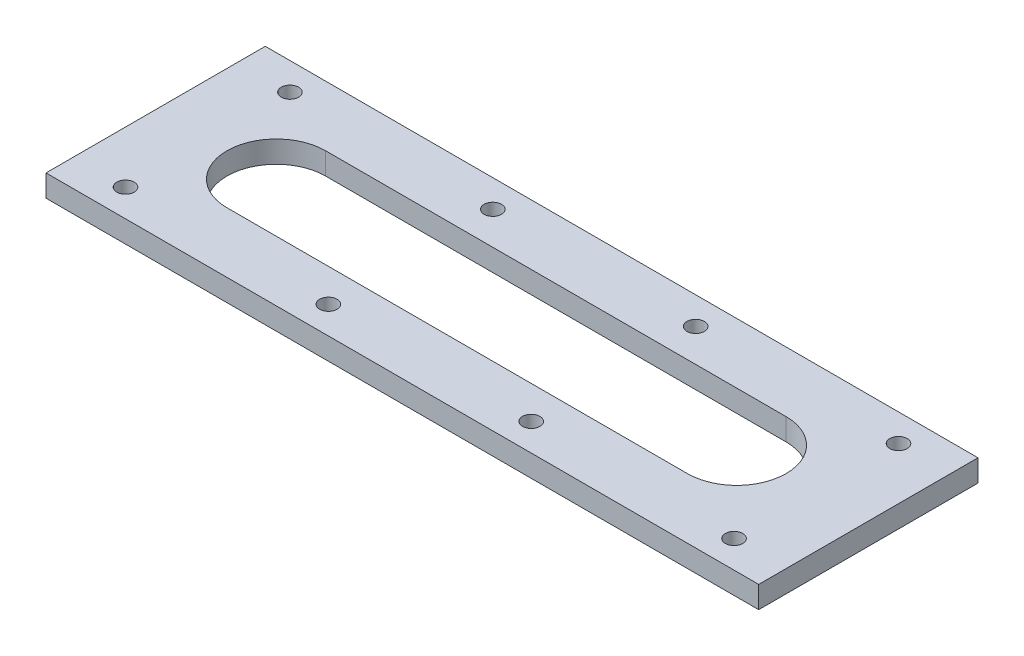
ISO-10303-21;
HEADER;
FILE_DESCRIPTION(('STEP AP214'),'2;1');
FILE_NAME('part.step','',(''),(''),'','','');
FILE_SCHEMA(('AUTOMOTIVE_DESIGN { 1 0 10303 214 1 1 1 1 }'));
ENDSEC;
DATA;
#1=APPLICATION_CONTEXT('core data for automotive mechanical design processes');
#2=APPLICATION_PROTOCOL_DEFINITION('international standard','automotive_design',2000,#1);
#3=PRODUCT_CONTEXT('',#1,'mechanical');
#4=PRODUCT('Part','Part','',(#3));
#5=PRODUCT_RELATED_PRODUCT_CATEGORY('part','',(#4));
#6=PRODUCT_DEFINITION_FORMATION('','',#4);
#7=PRODUCT_DEFINITION_CONTEXT('part definition',#1,'design');
#8=PRODUCT_DEFINITION('design','',#6,#7);
#9=PRODUCT_DEFINITION_SHAPE('','',#8);
#10=(LENGTH_UNIT() NAMED_UNIT(*) SI_UNIT(.MILLI.,.METRE.));
#11=(NAMED_UNIT(*) PLANE_ANGLE_UNIT() SI_UNIT($,.RADIAN.));
#12=(NAMED_UNIT(*) SI_UNIT($,.STERADIAN.) SOLID_ANGLE_UNIT());
#13=UNCERTAINTY_MEASURE_WITH_UNIT(LENGTH_MEASURE(1.E-05),#10,'distance_accuracy_value','');
#14=(GEOMETRIC_REPRESENTATION_CONTEXT(3) GLOBAL_UNCERTAINTY_ASSIGNED_CONTEXT((#13)) GLOBAL_UNIT_ASSIGNED_CONTEXT((#10,
#11,#12)) REPRESENTATION_CONTEXT('',''));
#15=CARTESIAN_POINT('',(0.,0.,0.));
#16=DIRECTION('',(0.,0.,1.));
#17=DIRECTION('',(1.,0.,0.));
#18=AXIS2_PLACEMENT_3D('',#15,#16,#17);
#19=CARTESIAN_POINT('',(0.,4.,0.));
#20=DIRECTION('',(0.,-1.,0.));
#21=DIRECTION('',(0.,0.,-1.));
#22=AXIS2_PLACEMENT_3D('',#19,#20,#21);
#23=PLANE('',#22);
#24=CARTESIAN_POINT('',(120.5,4.,-5.));
#25=DIRECTION('',(0.,-1.,0.));
#26=DIRECTION('',(0.,0.,-1.));
#27=AXIS2_PLACEMENT_3D('',#24,#25,#26);
#28=CIRCLE('',#27,1.58749999999999);
#29=CARTESIAN_POINT('',(120.5,4.,-6.5875));
#30=VERTEX_POINT('',#29);
#31=EDGE_CURVE('E39',#30,#30,#28,.T.);
#32=ORIENTED_EDGE('',*,*,#31,.T.);
#33=EDGE_LOOP('',(#32));
#34=FACE_BOUND('',#33,.T.);
#35=CARTESIAN_POINT('',(120.5,4.,-35.));
#36=DIRECTION('',(0.,-1.,0.));
#37=DIRECTION('',(0.,0.,-1.));
#38=AXIS2_PLACEMENT_3D('',#35,#36,#37);
#39=CIRCLE('',#38,1.58749999999999);
#40=CARTESIAN_POINT('',(120.5,4.,-36.5875));
#41=VERTEX_POINT('',#40);
#42=EDGE_CURVE('E192',#41,#41,#39,.T.);
#43=ORIENTED_EDGE('',*,*,#42,.T.);
#44=EDGE_LOOP('',(#43));
#45=FACE_BOUND('',#44,.T.);
#46=CARTESIAN_POINT('',(83.5,4.,-5.));
#47=DIRECTION('',(0.,-1.,0.));
#48=DIRECTION('',(0.,0.,-1.));
#49=AXIS2_PLACEMENT_3D('',#46,#47,#48);
#50=CIRCLE('',#49,1.58749999999999);
#51=CARTESIAN_POINT('',(83.5,4.,-6.5875));
#52=VERTEX_POINT('',#51);
#53=EDGE_CURVE('E188',#52,#52,#50,.T.);
#54=ORIENTED_EDGE('',*,*,#53,.T.);
#55=EDGE_LOOP('',(#54));
#56=FACE_BOUND('',#55,.T.);
#57=CARTESIAN_POINT('',(83.5,4.,-35.));
#58=DIRECTION('',(0.,-1.,0.));
#59=DIRECTION('',(0.,0.,-1.));
#60=AXIS2_PLACEMENT_3D('',#57,#58,#59);
#61=CIRCLE('',#60,1.58749999999999);
#62=CARTESIAN_POINT('',(83.5,4.,-36.5875));
#63=VERTEX_POINT('',#62);
#64=EDGE_CURVE('E183',#63,#63,#61,.T.);
#65=ORIENTED_EDGE('',*,*,#64,.T.);
#66=EDGE_LOOP('',(#65));
#67=FACE_BOUND('',#66,.T.);
#68=CARTESIAN_POINT('',(46.5,4.,-5.));
#69=DIRECTION('',(0.,-1.,0.));
#70=DIRECTION('',(0.,0.,-1.));
#71=AXIS2_PLACEMENT_3D('',#68,#69,#70);
#72=CIRCLE('',#71,1.5875);
#73=CARTESIAN_POINT('',(46.5,4.,-6.5875));
#74=VERTEX_POINT('',#73);
#75=EDGE_CURVE('E178',#74,#74,#72,.T.);
#76=ORIENTED_EDGE('',*,*,#75,.T.);
#77=EDGE_LOOP('',(#76));
#78=FACE_BOUND('',#77,.T.);
#79=CARTESIAN_POINT('',(46.5,4.,-35.));
#80=DIRECTION('',(0.,-1.,0.));
#81=DIRECTION('',(0.,0.,-1.));
#82=AXIS2_PLACEMENT_3D('',#79,#80,#81);
#83=CIRCLE('',#82,1.5875);
#84=CARTESIAN_POINT('',(46.5,4.,-36.5875));
#85=VERTEX_POINT('',#84);
#86=EDGE_CURVE('E173',#85,#85,#83,.T.);
#87=ORIENTED_EDGE('',*,*,#86,.T.);
#88=EDGE_LOOP('',(#87));
#89=FACE_BOUND('',#88,.T.);
#90=CARTESIAN_POINT('',(9.49999999999999,4.,-5.));
#91=DIRECTION('',(0.,-1.,0.));
#92=DIRECTION('',(0.,0.,-1.));
#93=AXIS2_PLACEMENT_3D('',#90,#91,#92);
#94=CIRCLE('',#93,1.5875);
#95=CARTESIAN_POINT('',(9.49999999999999,4.,-6.5875));
#96=VERTEX_POINT('',#95);
#97=EDGE_CURVE('E168',#96,#96,#94,.T.);
#98=ORIENTED_EDGE('',*,*,#97,.T.);
#99=EDGE_LOOP('',(#98));
#100=FACE_BOUND('',#99,.T.);
#101=CARTESIAN_POINT('',(9.49999999999999,4.,-35.));
#102=DIRECTION('',(0.,-1.,0.));
#103=DIRECTION('',(0.,0.,-1.));
#104=AXIS2_PLACEMENT_3D('',#101,#102,#103);
#105=CIRCLE('',#104,1.5875);
#106=CARTESIAN_POINT('',(9.49999999999999,4.,-36.5875));
#107=VERTEX_POINT('',#106);
#108=EDGE_CURVE('E130',#107,#107,#105,.T.);
#109=ORIENTED_EDGE('',*,*,#108,.T.);
#110=EDGE_LOOP('',(#109));
#111=FACE_BOUND('',#110,.T.);
#112=DIRECTION('',(0.,0.,1.));
#113=VECTOR('',#112,1.);
#114=CARTESIAN_POINT('',(0.,4.,0.));
#115=LINE('',#114,#113);
#116=CARTESIAN_POINT('',(0.,4.,-40.));
#117=VERTEX_POINT('',#116);
#118=CARTESIAN_POINT('',(0.,4.,0.));
#119=VERTEX_POINT('',#118);
#120=EDGE_CURVE('E140',#117,#119,#115,.T.);
#121=ORIENTED_EDGE('',*,*,#120,.T.);
#122=DIRECTION('',(1.,0.,0.));
#123=VECTOR('',#122,1.);
#124=CARTESIAN_POINT('',(0.,4.,0.));
#125=LINE('',#124,#123);
#126=CARTESIAN_POINT('',(130.,4.,0.));
#127=VERTEX_POINT('',#126);
#128=EDGE_CURVE('E143',#119,#127,#125,.T.);
#129=ORIENTED_EDGE('',*,*,#128,.T.);
#130=DIRECTION('',(0.,0.,-1.));
#131=VECTOR('',#130,1.);
#132=CARTESIAN_POINT('',(130.,4.,0.));
#133=LINE('',#132,#131);
#134=CARTESIAN_POINT('',(130.,4.,-40.));
#135=VERTEX_POINT('',#134);
#136=EDGE_CURVE('E146',#127,#135,#133,.T.);
#137=ORIENTED_EDGE('',*,*,#136,.T.);
#138=DIRECTION('',(-1.,0.,0.));
#139=VECTOR('',#138,1.);
#140=CARTESIAN_POINT('',(0.,4.,-40.));
#141=LINE('',#140,#139);
#142=EDGE_CURVE('E148',#135,#117,#141,.T.);
#143=ORIENTED_EDGE('',*,*,#142,.T.);
#144=EDGE_LOOP('',(#121,#129,#137,#143));
#145=FACE_BOUND('',#144,.T.);
#146=CARTESIAN_POINT('',(22.,4.,-20.));
#147=DIRECTION('',(0.,1.,0.));
#148=DIRECTION('',(0.,0.,1.));
#149=AXIS2_PLACEMENT_3D('',#146,#147,#148);
#150=CIRCLE('',#149,9.);
#151=CARTESIAN_POINT('',(22.,4.,-29.));
#152=VERTEX_POINT('',#151);
#153=CARTESIAN_POINT('',(22.,4.,-11.));
#154=VERTEX_POINT('',#153);
#155=EDGE_CURVE('E102',#152,#154,#150,.T.);
#156=ORIENTED_EDGE('',*,*,#155,.F.);
#157=DIRECTION('',(-1.,0.,0.));
#158=VECTOR('',#157,1.);
#159=CARTESIAN_POINT('',(22.,4.,-29.));
#160=LINE('',#159,#158);
#161=CARTESIAN_POINT('',(106.,4.,-29.));
#162=VERTEX_POINT('',#161);
#163=EDGE_CURVE('E124',#162,#152,#160,.T.);
#164=ORIENTED_EDGE('',*,*,#163,.F.);
#165=CARTESIAN_POINT('',(106.,4.,-20.));
#166=DIRECTION('',(0.,1.,0.));
#167=DIRECTION('',(0.,0.,1.));
#168=AXIS2_PLACEMENT_3D('',#165,#166,#167);
#169=CIRCLE('',#168,9.);
#170=CARTESIAN_POINT('',(106.,4.,-11.));
#171=VERTEX_POINT('',#170);
#172=EDGE_CURVE('E122',#171,#162,#169,.T.);
#173=ORIENTED_EDGE('',*,*,#172,.F.);
#174=DIRECTION('',(1.,0.,0.));
#175=VECTOR('',#174,1.);
#176=CARTESIAN_POINT('',(22.,4.,-11.));
#177=LINE('',#176,#175);
#178=EDGE_CURVE('E110',#154,#171,#177,.T.);
#179=ORIENTED_EDGE('',*,*,#178,.F.);
#180=EDGE_LOOP('',(#156,#164,#173,#179));
#181=FACE_BOUND('',#180,.T.);
#182=ADVANCED_FACE('F35',(#34,#45,#56,#67,#78,#89,#100,#111,#145,#181),#23,.F.);
#183=CARTESIAN_POINT('',(0.,0.,0.));
#184=DIRECTION('',(0.,-1.,0.));
#185=DIRECTION('',(0.,0.,-1.));
#186=AXIS2_PLACEMENT_3D('',#183,#184,#185);
#187=PLANE('',#186);
#188=CARTESIAN_POINT('',(120.5,0.,-5.));
#189=DIRECTION('',(0.,-1.,0.));
#190=DIRECTION('',(0.,0.,-1.));
#191=AXIS2_PLACEMENT_3D('',#188,#189,#190);
#192=CIRCLE('',#191,3.15);
#193=CARTESIAN_POINT('',(120.5,0.,-8.15));
#194=VERTEX_POINT('',#193);
#195=EDGE_CURVE('E451',#194,#194,#192,.T.);
#196=ORIENTED_EDGE('',*,*,#195,.F.);
#197=EDGE_LOOP('',(#196));
#198=FACE_BOUND('',#197,.T.);
#199=CARTESIAN_POINT('',(120.5,0.,-35.));
#200=DIRECTION('',(0.,-1.,0.));
#201=DIRECTION('',(0.,0.,-1.));
#202=AXIS2_PLACEMENT_3D('',#199,#200,#201);
#203=CIRCLE('',#202,3.15);
#204=CARTESIAN_POINT('',(120.5,0.,-38.15));
#205=VERTEX_POINT('',#204);
#206=EDGE_CURVE('E201',#205,#205,#203,.T.);
#207=ORIENTED_EDGE('',*,*,#206,.F.);
#208=EDGE_LOOP('',(#207));
#209=FACE_BOUND('',#208,.T.);
#210=CARTESIAN_POINT('',(83.5,0.,-5.));
#211=DIRECTION('',(0.,-1.,0.));
#212=DIRECTION('',(0.,0.,-1.));
#213=AXIS2_PLACEMENT_3D('',#210,#211,#212);
#214=CIRCLE('',#213,3.15);
#215=CARTESIAN_POINT('',(83.5,0.,-8.15));
#216=VERTEX_POINT('',#215);
#217=EDGE_CURVE('E194',#216,#216,#214,.T.);
#218=ORIENTED_EDGE('',*,*,#217,.F.);
#219=EDGE_LOOP('',(#218));
#220=FACE_BOUND('',#219,.T.);
#221=CARTESIAN_POINT('',(83.5,0.,-35.));
#222=DIRECTION('',(0.,-1.,0.));
#223=DIRECTION('',(0.,0.,-1.));
#224=AXIS2_PLACEMENT_3D('',#221,#222,#223);
#225=CIRCLE('',#224,3.15);
#226=CARTESIAN_POINT('',(83.5,0.,-38.15));
#227=VERTEX_POINT('',#226);
#228=EDGE_CURVE('E190',#227,#227,#225,.T.);
#229=ORIENTED_EDGE('',*,*,#228,.F.);
#230=EDGE_LOOP('',(#229));
#231=FACE_BOUND('',#230,.T.);
#232=CARTESIAN_POINT('',(46.5,0.,-5.));
#233=DIRECTION('',(0.,-1.,0.));
#234=DIRECTION('',(0.,0.,-1.));
#235=AXIS2_PLACEMENT_3D('',#232,#233,#234);
#236=CIRCLE('',#235,3.15);
#237=CARTESIAN_POINT('',(46.5,0.,-8.15));
#238=VERTEX_POINT('',#237);
#239=EDGE_CURVE('E186',#238,#238,#236,.T.);
#240=ORIENTED_EDGE('',*,*,#239,.F.);
#241=EDGE_LOOP('',(#240));
#242=FACE_BOUND('',#241,.T.);
#243=CARTESIAN_POINT('',(46.5,0.,-35.));
#244=DIRECTION('',(0.,-1.,0.));
#245=DIRECTION('',(0.,0.,-1.));
#246=AXIS2_PLACEMENT_3D('',#243,#244,#245);
#247=CIRCLE('',#246,3.15);
#248=CARTESIAN_POINT('',(46.5,0.,-38.15));
#249=VERTEX_POINT('',#248);
#250=EDGE_CURVE('E181',#249,#249,#247,.T.);
#251=ORIENTED_EDGE('',*,*,#250,.F.);
#252=EDGE_LOOP('',(#251));
#253=FACE_BOUND('',#252,.T.);
#254=CARTESIAN_POINT('',(9.49999999999999,0.,-5.));
#255=DIRECTION('',(0.,-1.,0.));
#256=DIRECTION('',(0.,0.,-1.));
#257=AXIS2_PLACEMENT_3D('',#254,#255,#256);
#258=CIRCLE('',#257,3.15);
#259=CARTESIAN_POINT('',(9.49999999999999,0.,-8.15));
#260=VERTEX_POINT('',#259);
#261=EDGE_CURVE('E176',#260,#260,#258,.T.);
#262=ORIENTED_EDGE('',*,*,#261,.F.);
#263=EDGE_LOOP('',(#262));
#264=FACE_BOUND('',#263,.T.);
#265=CARTESIAN_POINT('',(9.49999999999999,0.,-35.));
#266=DIRECTION('',(0.,-1.,0.));
#267=DIRECTION('',(0.,0.,-1.));
#268=AXIS2_PLACEMENT_3D('',#265,#266,#267);
#269=CIRCLE('',#268,3.15);
#270=CARTESIAN_POINT('',(9.49999999999999,0.,-38.15));
#271=VERTEX_POINT('',#270);
#272=EDGE_CURVE('E171',#271,#271,#269,.T.);
#273=ORIENTED_EDGE('',*,*,#272,.F.);
#274=EDGE_LOOP('',(#273));
#275=FACE_BOUND('',#274,.T.);
#276=DIRECTION('',(0.,0.,1.));
#277=VECTOR('',#276,1.);
#278=CARTESIAN_POINT('',(0.,0.,0.));
#279=LINE('',#278,#277);
#280=CARTESIAN_POINT('',(0.,0.,-40.));
#281=VERTEX_POINT('',#280);
#282=CARTESIAN_POINT('',(0.,0.,0.));
#283=VERTEX_POINT('',#282);
#284=EDGE_CURVE('E118',#281,#283,#279,.T.);
#285=ORIENTED_EDGE('',*,*,#284,.F.);
#286=DIRECTION('',(-1.,0.,0.));
#287=VECTOR('',#286,1.);
#288=CARTESIAN_POINT('',(0.,0.,-40.));
#289=LINE('',#288,#287);
#290=CARTESIAN_POINT('',(130.,0.,-40.));
#291=VERTEX_POINT('',#290);
#292=EDGE_CURVE('E144',#291,#281,#289,.T.);
#293=ORIENTED_EDGE('',*,*,#292,.F.);
#294=DIRECTION('',(0.,0.,-1.));
#295=VECTOR('',#294,1.);
#296=CARTESIAN_POINT('',(130.,0.,0.));
#297=LINE('',#296,#295);
#298=CARTESIAN_POINT('',(130.,0.,0.));
#299=VERTEX_POINT('',#298);
#300=EDGE_CURVE('E155',#299,#291,#297,.T.);
#301=ORIENTED_EDGE('',*,*,#300,.F.);
#302=DIRECTION('',(1.,0.,0.));
#303=VECTOR('',#302,1.);
#304=CARTESIAN_POINT('',(0.,0.,0.));
#305=LINE('',#304,#303);
#306=EDGE_CURVE('E153',#283,#299,#305,.T.);
#307=ORIENTED_EDGE('',*,*,#306,.F.);
#308=EDGE_LOOP('',(#285,#293,#301,#307));
#309=FACE_BOUND('',#308,.T.);
#310=DIRECTION('',(-1.,0.,0.));
#311=VECTOR('',#310,1.);
#312=CARTESIAN_POINT('',(22.,0.,-29.));
#313=LINE('',#312,#311);
#314=CARTESIAN_POINT('',(106.,0.,-29.));
#315=VERTEX_POINT('',#314);
#316=CARTESIAN_POINT('',(22.,0.,-29.));
#317=VERTEX_POINT('',#316);
#318=EDGE_CURVE('E111',#315,#317,#313,.T.);
#319=ORIENTED_EDGE('',*,*,#318,.T.);
#320=CARTESIAN_POINT('',(22.,0.,-20.));
#321=DIRECTION('',(0.,1.,0.));
#322=DIRECTION('',(0.,0.,1.));
#323=AXIS2_PLACEMENT_3D('',#320,#321,#322);
#324=CIRCLE('',#323,9.);
#325=CARTESIAN_POINT('',(22.,0.,-11.));
#326=VERTEX_POINT('',#325);
#327=EDGE_CURVE('E60',#317,#326,#324,.T.);
#328=ORIENTED_EDGE('',*,*,#327,.T.);
#329=DIRECTION('',(1.,0.,0.));
#330=VECTOR('',#329,1.);
#331=CARTESIAN_POINT('',(22.,0.,-11.));
#332=LINE('',#331,#330);
#333=CARTESIAN_POINT('',(106.,0.,-11.));
#334=VERTEX_POINT('',#333);
#335=EDGE_CURVE('E117',#326,#334,#332,.T.);
#336=ORIENTED_EDGE('',*,*,#335,.T.);
#337=CARTESIAN_POINT('',(106.,0.,-20.));
#338=DIRECTION('',(0.,1.,0.));
#339=DIRECTION('',(0.,0.,1.));
#340=AXIS2_PLACEMENT_3D('',#337,#338,#339);
#341=CIRCLE('',#340,9.);
#342=EDGE_CURVE('E132',#334,#315,#341,.T.);
#343=ORIENTED_EDGE('',*,*,#342,.T.);
#344=EDGE_LOOP('',(#319,#328,#336,#343));
#345=FACE_BOUND('',#344,.T.);
#346=ADVANCED_FACE('F241',(#198,#209,#220,#231,#242,#253,#264,#275,#309,#345),#187,.T.);
#347=CARTESIAN_POINT('',(0.,4.,0.));
#348=DIRECTION('',(1.,0.,0.));
#349=DIRECTION('',(0.,0.,-1.));
#350=AXIS2_PLACEMENT_3D('',#347,#348,#349);
#351=PLANE('',#350);
#352=ORIENTED_EDGE('',*,*,#284,.T.);
#353=DIRECTION('',(0.,-1.,0.));
#354=VECTOR('',#353,1.);
#355=CARTESIAN_POINT('',(0.,4.,0.));
#356=LINE('',#355,#354);
#357=EDGE_CURVE('E11',#119,#283,#356,.T.);
#358=ORIENTED_EDGE('',*,*,#357,.F.);
#359=ORIENTED_EDGE('',*,*,#120,.F.);
#360=DIRECTION('',(0.,-1.,0.));
#361=VECTOR('',#360,1.);
#362=CARTESIAN_POINT('',(0.,4.,-40.));
#363=LINE('',#362,#361);
#364=EDGE_CURVE('E150',#117,#281,#363,.T.);
#365=ORIENTED_EDGE('',*,*,#364,.T.);
#366=EDGE_LOOP('',(#352,#358,#359,#365));
#367=FACE_BOUND('',#366,.T.);
#368=ADVANCED_FACE('F37',(#367),#351,.F.);
#369=CARTESIAN_POINT('',(0.,4.,0.));
#370=DIRECTION('',(0.,0.,-1.));
#371=DIRECTION('',(-1.,0.,0.));
#372=AXIS2_PLACEMENT_3D('',#369,#370,#371);
#373=PLANE('',#372);
#374=ORIENTED_EDGE('',*,*,#306,.T.);
#375=DIRECTION('',(0.,-1.,0.));
#376=VECTOR('',#375,1.);
#377=CARTESIAN_POINT('',(130.,4.,0.));
#378=LINE('',#377,#376);
#379=EDGE_CURVE('E44',#127,#299,#378,.T.);
#380=ORIENTED_EDGE('',*,*,#379,.F.);
#381=ORIENTED_EDGE('',*,*,#128,.F.);
#382=ORIENTED_EDGE('',*,*,#357,.T.);
#383=EDGE_LOOP('',(#374,#380,#381,#382));
#384=FACE_BOUND('',#383,.T.);
#385=ADVANCED_FACE('F276',(#384),#373,.F.);
#386=CARTESIAN_POINT('',(130.,4.,0.));
#387=DIRECTION('',(-1.,0.,0.));
#388=DIRECTION('',(0.,0.,1.));
#389=AXIS2_PLACEMENT_3D('',#386,#387,#388);
#390=PLANE('',#389);
#391=ORIENTED_EDGE('',*,*,#300,.T.);
#392=DIRECTION('',(0.,-1.,0.));
#393=VECTOR('',#392,1.);
#394=CARTESIAN_POINT('',(130.,4.,-40.));
#395=LINE('',#394,#393);
#396=EDGE_CURVE('E160',#135,#291,#395,.T.);
#397=ORIENTED_EDGE('',*,*,#396,.F.);
#398=ORIENTED_EDGE('',*,*,#136,.F.);
#399=ORIENTED_EDGE('',*,*,#379,.T.);
#400=EDGE_LOOP('',(#391,#397,#398,#399));
#401=FACE_BOUND('',#400,.T.);
#402=ADVANCED_FACE('F273',(#401),#390,.F.);
#403=CARTESIAN_POINT('',(0.,4.,-40.));
#404=DIRECTION('',(0.,0.,1.));
#405=DIRECTION('',(1.,0.,0.));
#406=AXIS2_PLACEMENT_3D('',#403,#404,#405);
#407=PLANE('',#406);
#408=ORIENTED_EDGE('',*,*,#292,.T.);
#409=ORIENTED_EDGE('',*,*,#364,.F.);
#410=ORIENTED_EDGE('',*,*,#142,.F.);
#411=ORIENTED_EDGE('',*,*,#396,.T.);
#412=EDGE_LOOP('',(#408,#409,#410,#411));
#413=FACE_BOUND('',#412,.T.);
#414=ADVANCED_FACE('F270',(#413),#407,.F.);
#415=CARTESIAN_POINT('',(22.,4.,-20.));
#416=DIRECTION('',(0.,-1.,0.));
#417=DIRECTION('',(0.,0.,-1.));
#418=AXIS2_PLACEMENT_3D('',#415,#416,#417);
#419=CYLINDRICAL_SURFACE('',#418,9.);
#420=ORIENTED_EDGE('',*,*,#327,.F.);
#421=DIRECTION('',(0.,-1.,0.));
#422=VECTOR('',#421,1.);
#423=CARTESIAN_POINT('',(22.,4.,-29.));
#424=LINE('',#423,#422);
#425=EDGE_CURVE('E106',#152,#317,#424,.T.);
#426=ORIENTED_EDGE('',*,*,#425,.F.);
#427=ORIENTED_EDGE('',*,*,#155,.T.);
#428=DIRECTION('',(0.,-1.,0.));
#429=VECTOR('',#428,1.);
#430=CARTESIAN_POINT('',(22.,4.,-11.));
#431=LINE('',#430,#429);
#432=EDGE_CURVE('E105',#154,#326,#431,.T.);
#433=ORIENTED_EDGE('',*,*,#432,.T.);
#434=EDGE_LOOP('',(#420,#426,#427,#433));
#435=FACE_BOUND('',#434,.T.);
#436=ADVANCED_FACE('F104',(#435),#419,.F.);
#437=CARTESIAN_POINT('',(22.,4.,-11.));
#438=DIRECTION('',(0.,0.,-1.));
#439=DIRECTION('',(-1.,0.,0.));
#440=AXIS2_PLACEMENT_3D('',#437,#438,#439);
#441=PLANE('',#440);
#442=ORIENTED_EDGE('',*,*,#335,.F.);
#443=ORIENTED_EDGE('',*,*,#432,.F.);
#444=ORIENTED_EDGE('',*,*,#178,.T.);
#445=DIRECTION('',(0.,-1.,0.));
#446=VECTOR('',#445,1.);
#447=CARTESIAN_POINT('',(106.,4.,-11.));
#448=LINE('',#447,#446);
#449=EDGE_CURVE('E119',#171,#334,#448,.T.);
#450=ORIENTED_EDGE('',*,*,#449,.T.);
#451=EDGE_LOOP('',(#442,#443,#444,#450));
#452=FACE_BOUND('',#451,.T.);
#453=ADVANCED_FACE('F114',(#452),#441,.T.);
#454=CARTESIAN_POINT('',(106.,4.,-20.));
#455=DIRECTION('',(0.,-1.,0.));
#456=DIRECTION('',(0.,0.,-1.));
#457=AXIS2_PLACEMENT_3D('',#454,#455,#456);
#458=CYLINDRICAL_SURFACE('',#457,9.);
#459=ORIENTED_EDGE('',*,*,#342,.F.);
#460=ORIENTED_EDGE('',*,*,#449,.F.);
#461=ORIENTED_EDGE('',*,*,#172,.T.);
#462=DIRECTION('',(0.,-1.,0.));
#463=VECTOR('',#462,1.);
#464=CARTESIAN_POINT('',(106.,4.,-29.));
#465=LINE('',#464,#463);
#466=EDGE_CURVE('E52',#162,#315,#465,.T.);
#467=ORIENTED_EDGE('',*,*,#466,.T.);
#468=EDGE_LOOP('',(#459,#460,#461,#467));
#469=FACE_BOUND('',#468,.T.);
#470=ADVANCED_FACE('F252',(#469),#458,.F.);
#471=CARTESIAN_POINT('',(22.,4.,-29.));
#472=DIRECTION('',(0.,0.,1.));
#473=DIRECTION('',(1.,0.,0.));
#474=AXIS2_PLACEMENT_3D('',#471,#472,#473);
#475=PLANE('',#474);
#476=ORIENTED_EDGE('',*,*,#318,.F.);
#477=ORIENTED_EDGE('',*,*,#466,.F.);
#478=ORIENTED_EDGE('',*,*,#163,.T.);
#479=ORIENTED_EDGE('',*,*,#425,.T.);
#480=EDGE_LOOP('',(#476,#477,#478,#479));
#481=FACE_BOUND('',#480,.T.);
#482=ADVANCED_FACE('F250',(#481),#475,.T.);
#483=CARTESIAN_POINT('',(9.49999999999999,0.,-35.));
#484=DIRECTION('',(0.,-1.,0.));
#485=DIRECTION('',(0.,0.,-1.));
#486=AXIS2_PLACEMENT_3D('',#483,#484,#485);
#487=CYLINDRICAL_SURFACE('',#486,1.5875);
#488=CARTESIAN_POINT('',(9.49999999999999,1.5625,-35.));
#489=DIRECTION('',(0.,-1.,0.));
#490=DIRECTION('',(0.,0.,-1.));
#491=AXIS2_PLACEMENT_3D('',#488,#489,#490);
#492=CIRCLE('',#491,1.5875);
#493=CARTESIAN_POINT('',(9.49999999999999,1.5625,-36.5875));
#494=VERTEX_POINT('',#493);
#495=EDGE_CURVE('E167',#494,#494,#492,.T.);
#496=ORIENTED_EDGE('',*,*,#495,.T.);
#497=EDGE_LOOP('',(#496));
#498=FACE_BOUND('',#497,.T.);
#499=ORIENTED_EDGE('',*,*,#108,.F.);
#500=EDGE_LOOP('',(#499));
#501=FACE_BOUND('',#500,.T.);
#502=ADVANCED_FACE('F231',(#498,#501),#487,.F.);
#503=CARTESIAN_POINT('',(9.49999999999999,0.,-35.));
#504=DIRECTION('',(0.,-1.,0.));
#505=DIRECTION('',(0.,0.,-1.));
#506=AXIS2_PLACEMENT_3D('',#503,#504,#505);
#507=CONICAL_SURFACE('',#506,3.15,0.785398163397448);
#508=ORIENTED_EDGE('',*,*,#495,.F.);
#509=EDGE_LOOP('',(#508));
#510=FACE_BOUND('',#509,.T.);
#511=ORIENTED_EDGE('',*,*,#272,.T.);
#512=EDGE_LOOP('',(#511));
#513=FACE_BOUND('',#512,.T.);
#514=ADVANCED_FACE('F234',(#510,#513),#507,.F.);
#515=CARTESIAN_POINT('',(9.49999999999999,0.,-5.));
#516=DIRECTION('',(0.,-1.,0.));
#517=DIRECTION('',(0.,0.,-1.));
#518=AXIS2_PLACEMENT_3D('',#515,#516,#517);
#519=CYLINDRICAL_SURFACE('',#518,1.5875);
#520=CARTESIAN_POINT('',(9.49999999999999,1.5625,-5.));
#521=DIRECTION('',(0.,-1.,0.));
#522=DIRECTION('',(0.,0.,-1.));
#523=AXIS2_PLACEMENT_3D('',#520,#521,#522);
#524=CIRCLE('',#523,1.5875);
#525=CARTESIAN_POINT('',(9.49999999999999,1.5625,-6.5875));
#526=VERTEX_POINT('',#525);
#527=EDGE_CURVE('E172',#526,#526,#524,.T.);
#528=ORIENTED_EDGE('',*,*,#527,.T.);
#529=EDGE_LOOP('',(#528));
#530=FACE_BOUND('',#529,.T.);
#531=ORIENTED_EDGE('',*,*,#97,.F.);
#532=EDGE_LOOP('',(#531));
#533=FACE_BOUND('',#532,.T.);
#534=ADVANCED_FACE('F237',(#530,#533),#519,.F.);
#535=CARTESIAN_POINT('',(9.49999999999999,0.,-5.));
#536=DIRECTION('',(0.,-1.,0.));
#537=DIRECTION('',(0.,0.,-1.));
#538=AXIS2_PLACEMENT_3D('',#535,#536,#537);
#539=CONICAL_SURFACE('',#538,3.15,0.785398163397448);
#540=ORIENTED_EDGE('',*,*,#527,.F.);
#541=EDGE_LOOP('',(#540));
#542=FACE_BOUND('',#541,.T.);
#543=ORIENTED_EDGE('',*,*,#261,.T.);
#544=EDGE_LOOP('',(#543));
#545=FACE_BOUND('',#544,.T.);
#546=ADVANCED_FACE('F311',(#542,#545),#539,.F.);
#547=CARTESIAN_POINT('',(46.5,0.,-35.));
#548=DIRECTION('',(0.,-1.,0.));
#549=DIRECTION('',(0.,0.,-1.));
#550=AXIS2_PLACEMENT_3D('',#547,#548,#549);
#551=CYLINDRICAL_SURFACE('',#550,1.5875);
#552=CARTESIAN_POINT('',(46.5,1.5625,-35.));
#553=DIRECTION('',(0.,-1.,0.));
#554=DIRECTION('',(0.,0.,-1.));
#555=AXIS2_PLACEMENT_3D('',#552,#553,#554);
#556=CIRCLE('',#555,1.5875);
#557=CARTESIAN_POINT('',(46.5,1.5625,-36.5875));
#558=VERTEX_POINT('',#557);
#559=EDGE_CURVE('E177',#558,#558,#556,.T.);
#560=ORIENTED_EDGE('',*,*,#559,.T.);
#561=EDGE_LOOP('',(#560));
#562=FACE_BOUND('',#561,.T.);
#563=ORIENTED_EDGE('',*,*,#86,.F.);
#564=EDGE_LOOP('',(#563));
#565=FACE_BOUND('',#564,.T.);
#566=ADVANCED_FACE('F322',(#562,#565),#551,.F.);
#567=CARTESIAN_POINT('',(46.5,0.,-35.));
#568=DIRECTION('',(0.,-1.,0.));
#569=DIRECTION('',(0.,0.,-1.));
#570=AXIS2_PLACEMENT_3D('',#567,#568,#569);
#571=CONICAL_SURFACE('',#570,3.15,0.785398163397448);
#572=ORIENTED_EDGE('',*,*,#559,.F.);
#573=EDGE_LOOP('',(#572));
#574=FACE_BOUND('',#573,.T.);
#575=ORIENTED_EDGE('',*,*,#250,.T.);
#576=EDGE_LOOP('',(#575));
#577=FACE_BOUND('',#576,.T.);
#578=ADVANCED_FACE('F332',(#574,#577),#571,.F.);
#579=CARTESIAN_POINT('',(46.5,0.,-5.));
#580=DIRECTION('',(0.,-1.,0.));
#581=DIRECTION('',(0.,0.,-1.));
#582=AXIS2_PLACEMENT_3D('',#579,#580,#581);
#583=CYLINDRICAL_SURFACE('',#582,1.5875);
#584=CARTESIAN_POINT('',(46.5,1.5625,-5.));
#585=DIRECTION('',(0.,-1.,0.));
#586=DIRECTION('',(0.,0.,-1.));
#587=AXIS2_PLACEMENT_3D('',#584,#585,#586);
#588=CIRCLE('',#587,1.5875);
#589=CARTESIAN_POINT('',(46.5,1.5625,-6.5875));
#590=VERTEX_POINT('',#589);
#591=EDGE_CURVE('E182',#590,#590,#588,.T.);
#592=ORIENTED_EDGE('',*,*,#591,.T.);
#593=EDGE_LOOP('',(#592));
#594=FACE_BOUND('',#593,.T.);
#595=ORIENTED_EDGE('',*,*,#75,.F.);
#596=EDGE_LOOP('',(#595));
#597=FACE_BOUND('',#596,.T.);
#598=ADVANCED_FACE('F342',(#594,#597),#583,.F.);
#599=CARTESIAN_POINT('',(46.5,0.,-5.));
#600=DIRECTION('',(0.,-1.,0.));
#601=DIRECTION('',(0.,0.,-1.));
#602=AXIS2_PLACEMENT_3D('',#599,#600,#601);
#603=CONICAL_SURFACE('',#602,3.15,0.785398163397448);
#604=ORIENTED_EDGE('',*,*,#591,.F.);
#605=EDGE_LOOP('',(#604));
#606=FACE_BOUND('',#605,.T.);
#607=ORIENTED_EDGE('',*,*,#239,.T.);
#608=EDGE_LOOP('',(#607));
#609=FACE_BOUND('',#608,.T.);
#610=ADVANCED_FACE('F352',(#606,#609),#603,.F.);
#611=CARTESIAN_POINT('',(83.5,0.,-35.));
#612=DIRECTION('',(0.,-1.,0.));
#613=DIRECTION('',(0.,0.,-1.));
#614=AXIS2_PLACEMENT_3D('',#611,#612,#613);
#615=CYLINDRICAL_SURFACE('',#614,1.58749999999999);
#616=CARTESIAN_POINT('',(83.5,1.5625,-35.));
#617=DIRECTION('',(0.,-1.,0.));
#618=DIRECTION('',(0.,0.,-1.));
#619=AXIS2_PLACEMENT_3D('',#616,#617,#618);
#620=CIRCLE('',#619,1.58749999999999);
#621=CARTESIAN_POINT('',(83.5,1.5625,-36.5875));
#622=VERTEX_POINT('',#621);
#623=EDGE_CURVE('E187',#622,#622,#620,.T.);
#624=ORIENTED_EDGE('',*,*,#623,.T.);
#625=EDGE_LOOP('',(#624));
#626=FACE_BOUND('',#625,.T.);
#627=ORIENTED_EDGE('',*,*,#64,.F.);
#628=EDGE_LOOP('',(#627));
#629=FACE_BOUND('',#628,.T.);
#630=ADVANCED_FACE('F362',(#626,#629),#615,.F.);
#631=CARTESIAN_POINT('',(83.5,0.,-35.));
#632=DIRECTION('',(0.,-1.,0.));
#633=DIRECTION('',(0.,0.,-1.));
#634=AXIS2_PLACEMENT_3D('',#631,#632,#633);
#635=CONICAL_SURFACE('',#634,3.15,0.78539816339745);
#636=ORIENTED_EDGE('',*,*,#623,.F.);
#637=EDGE_LOOP('',(#636));
#638=FACE_BOUND('',#637,.T.);
#639=ORIENTED_EDGE('',*,*,#228,.T.);
#640=EDGE_LOOP('',(#639));
#641=FACE_BOUND('',#640,.T.);
#642=ADVANCED_FACE('F372',(#638,#641),#635,.F.);
#643=CARTESIAN_POINT('',(83.5,0.,-5.));
#644=DIRECTION('',(0.,-1.,0.));
#645=DIRECTION('',(0.,0.,-1.));
#646=AXIS2_PLACEMENT_3D('',#643,#644,#645);
#647=CYLINDRICAL_SURFACE('',#646,1.58749999999999);
#648=CARTESIAN_POINT('',(83.5,1.5625,-5.));
#649=DIRECTION('',(0.,-1.,0.));
#650=DIRECTION('',(0.,0.,-1.));
#651=AXIS2_PLACEMENT_3D('',#648,#649,#650);
#652=CIRCLE('',#651,1.58749999999999);
#653=CARTESIAN_POINT('',(83.5,1.5625,-6.5875));
#654=VERTEX_POINT('',#653);
#655=EDGE_CURVE('E191',#654,#654,#652,.T.);
#656=ORIENTED_EDGE('',*,*,#655,.T.);
#657=EDGE_LOOP('',(#656));
#658=FACE_BOUND('',#657,.T.);
#659=ORIENTED_EDGE('',*,*,#53,.F.);
#660=EDGE_LOOP('',(#659));
#661=FACE_BOUND('',#660,.T.);
#662=ADVANCED_FACE('F382',(#658,#661),#647,.F.);
#663=CARTESIAN_POINT('',(83.5,0.,-5.));
#664=DIRECTION('',(0.,-1.,0.));
#665=DIRECTION('',(0.,0.,-1.));
#666=AXIS2_PLACEMENT_3D('',#663,#664,#665);
#667=CONICAL_SURFACE('',#666,3.15,0.78539816339745);
#668=ORIENTED_EDGE('',*,*,#655,.F.);
#669=EDGE_LOOP('',(#668));
#670=FACE_BOUND('',#669,.T.);
#671=ORIENTED_EDGE('',*,*,#217,.T.);
#672=EDGE_LOOP('',(#671));
#673=FACE_BOUND('',#672,.T.);
#674=ADVANCED_FACE('F392',(#670,#673),#667,.F.);
#675=CARTESIAN_POINT('',(120.5,0.,-35.));
#676=DIRECTION('',(0.,-1.,0.));
#677=DIRECTION('',(0.,0.,-1.));
#678=AXIS2_PLACEMENT_3D('',#675,#676,#677);
#679=CYLINDRICAL_SURFACE('',#678,1.58749999999999);
#680=CARTESIAN_POINT('',(120.5,1.5625,-35.));
#681=DIRECTION('',(0.,-1.,0.));
#682=DIRECTION('',(0.,0.,-1.));
#683=AXIS2_PLACEMENT_3D('',#680,#681,#682);
#684=CIRCLE('',#683,1.58749999999999);
#685=CARTESIAN_POINT('',(120.5,1.5625,-36.5875));
#686=VERTEX_POINT('',#685);
#687=EDGE_CURVE('E195',#686,#686,#684,.T.);
#688=ORIENTED_EDGE('',*,*,#687,.T.);
#689=EDGE_LOOP('',(#688));
#690=FACE_BOUND('',#689,.T.);
#691=ORIENTED_EDGE('',*,*,#42,.F.);
#692=EDGE_LOOP('',(#691));
#693=FACE_BOUND('',#692,.T.);
#694=ADVANCED_FACE('F402',(#690,#693),#679,.F.);
#695=CARTESIAN_POINT('',(120.5,0.,-35.));
#696=DIRECTION('',(0.,-1.,0.));
#697=DIRECTION('',(0.,0.,-1.));
#698=AXIS2_PLACEMENT_3D('',#695,#696,#697);
#699=CONICAL_SURFACE('',#698,3.15,0.78539816339745);
#700=ORIENTED_EDGE('',*,*,#687,.F.);
#701=EDGE_LOOP('',(#700));
#702=FACE_BOUND('',#701,.T.);
#703=ORIENTED_EDGE('',*,*,#206,.T.);
#704=EDGE_LOOP('',(#703));
#705=FACE_BOUND('',#704,.T.);
#706=ADVANCED_FACE('F412',(#702,#705),#699,.F.);
#707=CARTESIAN_POINT('',(120.5,0.,-5.));
#708=DIRECTION('',(0.,-1.,0.));
#709=DIRECTION('',(0.,0.,-1.));
#710=AXIS2_PLACEMENT_3D('',#707,#708,#709);
#711=CYLINDRICAL_SURFACE('',#710,1.58749999999999);
#712=CARTESIAN_POINT('',(120.5,1.5625,-5.));
#713=DIRECTION('',(0.,-1.,0.));
#714=DIRECTION('',(0.,0.,-1.));
#715=AXIS2_PLACEMENT_3D('',#712,#713,#714);
#716=CIRCLE('',#715,1.58749999999999);
#717=CARTESIAN_POINT('',(120.5,1.5625,-6.5875));
#718=VERTEX_POINT('',#717);
#719=EDGE_CURVE('E448',#718,#718,#716,.T.);
#720=ORIENTED_EDGE('',*,*,#719,.T.);
#721=EDGE_LOOP('',(#720));
#722=FACE_BOUND('',#721,.T.);
#723=ORIENTED_EDGE('',*,*,#31,.F.);
#724=EDGE_LOOP('',(#723));
#725=FACE_BOUND('',#724,.T.);
#726=ADVANCED_FACE('F421',(#722,#725),#711,.F.);
#727=CARTESIAN_POINT('',(120.5,0.,-5.));
#728=DIRECTION('',(0.,-1.,0.));
#729=DIRECTION('',(0.,0.,-1.));
#730=AXIS2_PLACEMENT_3D('',#727,#728,#729);
#731=CONICAL_SURFACE('',#730,3.15,0.78539816339745);
#732=ORIENTED_EDGE('',*,*,#719,.F.);
#733=EDGE_LOOP('',(#732));
#734=FACE_BOUND('',#733,.T.);
#735=ORIENTED_EDGE('',*,*,#195,.T.);
#736=EDGE_LOOP('',(#735));
#737=FACE_BOUND('',#736,.T.);
#738=ADVANCED_FACE('F431',(#734,#737),#731,.F.);
#739=CLOSED_SHELL('',(#182,#346,#368,#385,#402,#414,#436,#453,#470,#482,#502,#514,#534,#546,
#566,#578,#598,#610,#630,#642,#662,#674,#694,#706,#726,#738));
#740=MANIFOLD_SOLID_BREP('B2',#739);
#741=ADVANCED_BREP_SHAPE_REPRESENTATION('',(#18,#740),#14);
#742=SHAPE_DEFINITION_REPRESENTATION(#9,#741);
ENDSEC;
END-ISO-10303-21;
